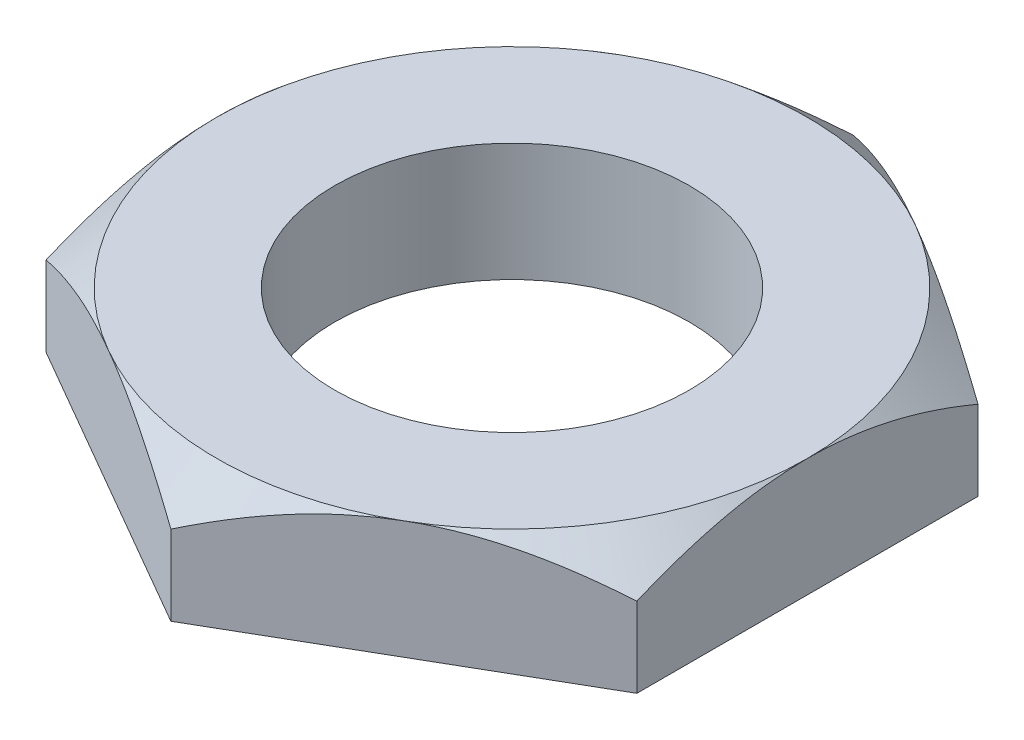
ISO-10303-21;
HEADER;
FILE_DESCRIPTION(('STEP AP214'),'2;1');
FILE_NAME('part.step','',(''),(''),'','','');
FILE_SCHEMA(('AUTOMOTIVE_DESIGN { 1 0 10303 214 1 1 1 1 }'));
ENDSEC;
DATA;
#1=APPLICATION_CONTEXT('core data for automotive mechanical design processes');
#2=APPLICATION_PROTOCOL_DEFINITION('international standard','automotive_design',2000,#1);
#3=PRODUCT_CONTEXT('',#1,'mechanical');
#4=PRODUCT('Part','Part','',(#3));
#5=PRODUCT_RELATED_PRODUCT_CATEGORY('part','',(#4));
#6=PRODUCT_DEFINITION_FORMATION('','',#4);
#7=PRODUCT_DEFINITION_CONTEXT('part definition',#1,'design');
#8=PRODUCT_DEFINITION('design','',#6,#7);
#9=PRODUCT_DEFINITION_SHAPE('','',#8);
#10=(LENGTH_UNIT() NAMED_UNIT(*) SI_UNIT(.MILLI.,.METRE.));
#11=(NAMED_UNIT(*) PLANE_ANGLE_UNIT() SI_UNIT($,.RADIAN.));
#12=(NAMED_UNIT(*) SI_UNIT($,.STERADIAN.) SOLID_ANGLE_UNIT());
#13=UNCERTAINTY_MEASURE_WITH_UNIT(LENGTH_MEASURE(1.E-05),#10,'distance_accuracy_value','');
#14=(GEOMETRIC_REPRESENTATION_CONTEXT(3) GLOBAL_UNCERTAINTY_ASSIGNED_CONTEXT((#13)) GLOBAL_UNIT_ASSIGNED_CONTEXT((#10,
#11,#12)) REPRESENTATION_CONTEXT('',''));
#15=CARTESIAN_POINT('',(0.,0.,0.));
#16=DIRECTION('',(0.,0.,1.));
#17=DIRECTION('',(1.,0.,0.));
#18=AXIS2_PLACEMENT_3D('',#15,#16,#17);
#19=CARTESIAN_POINT('',(0.,2.,0.));
#20=DIRECTION('',(0.,1.,0.));
#21=DIRECTION('',(0.,0.,1.));
#22=AXIS2_PLACEMENT_3D('',#19,#20,#21);
#23=PLANE('',#22);
#24=CARTESIAN_POINT('',(0.,2.,0.));
#25=DIRECTION('',(0.,1.,0.));
#26=DIRECTION('',(0.,0.,1.));
#27=AXIS2_PLACEMENT_3D('',#24,#25,#26);
#28=CIRCLE('',#27,3.);
#29=CARTESIAN_POINT('',(0.,2.,3.));
#30=VERTEX_POINT('',#29);
#31=EDGE_CURVE('E185',#30,#30,#28,.T.);
#32=ORIENTED_EDGE('',*,*,#31,.F.);
#33=EDGE_LOOP('',(#32));
#34=FACE_BOUND('',#33,.T.);
#35=CARTESIAN_POINT('',(0.,2.,0.));
#36=DIRECTION('',(0.,1.,0.));
#37=DIRECTION('',(0.,0.,1.));
#38=AXIS2_PLACEMENT_3D('',#35,#36,#37);
#39=CIRCLE('',#38,5.00000000000002);
#40=CARTESIAN_POINT('',(-2.50000000000003,2.,-4.33012701892217));
#41=VERTEX_POINT('',#40);
#42=CARTESIAN_POINT('',(-5.,2.,0.));
#43=VERTEX_POINT('',#42);
#44=EDGE_CURVE('E48',#41,#43,#39,.T.);
#45=ORIENTED_EDGE('',*,*,#44,.T.);
#46=CARTESIAN_POINT('',(-2.49999999999997,2.,4.3301270189222));
#47=VERTEX_POINT('',#46);
#48=EDGE_CURVE('E56',#43,#47,#39,.T.);
#49=ORIENTED_EDGE('',*,*,#48,.T.);
#50=CARTESIAN_POINT('',(2.50000000000003,2.,4.33012701892217));
#51=VERTEX_POINT('',#50);
#52=EDGE_CURVE('E184',#47,#51,#39,.T.);
#53=ORIENTED_EDGE('',*,*,#52,.T.);
#54=CARTESIAN_POINT('',(4.99999999999999,2.,0.));
#55=VERTEX_POINT('',#54);
#56=EDGE_CURVE('E181',#51,#55,#39,.T.);
#57=ORIENTED_EDGE('',*,*,#56,.T.);
#58=CARTESIAN_POINT('',(2.49999999999996,2.,-4.33012701892222));
#59=VERTEX_POINT('',#58);
#60=EDGE_CURVE('E132',#55,#59,#39,.T.);
#61=ORIENTED_EDGE('',*,*,#60,.T.);
#62=EDGE_CURVE('E323',#59,#41,#39,.T.);
#63=ORIENTED_EDGE('',*,*,#62,.T.);
#64=EDGE_LOOP('',(#45,#49,#53,#57,#61,#63));
#65=FACE_BOUND('',#64,.T.);
#66=ADVANCED_FACE('F33',(#34,#65),#23,.T.);
#67=CARTESIAN_POINT('',(0.,0.,0.));
#68=DIRECTION('',(0.,1.,0.));
#69=DIRECTION('',(0.,0.,1.));
#70=AXIS2_PLACEMENT_3D('',#67,#68,#69);
#71=PLANE('',#70);
#72=DIRECTION('',(-0.866025403784443,0.,-0.499999999999992));
#73=VECTOR('',#72,1.);
#74=CARTESIAN_POINT('',(4.99999999999996,0.,-2.88675134594819));
#75=LINE('',#74,#73);
#76=CARTESIAN_POINT('',(4.99999999999996,0.,-2.88675134594819));
#77=VERTEX_POINT('',#76);
#78=CARTESIAN_POINT('',(0.,0.,-5.77350269189626));
#79=VERTEX_POINT('',#78);
#80=EDGE_CURVE('E188',#77,#79,#75,.T.);
#81=ORIENTED_EDGE('',*,*,#80,.F.);
#82=DIRECTION('',(0.,0.,-1.));
#83=VECTOR('',#82,1.);
#84=CARTESIAN_POINT('',(5.00000000000002,0.,2.88675134594808));
#85=LINE('',#84,#83);
#86=CARTESIAN_POINT('',(5.00000000000002,0.,2.88675134594808));
#87=VERTEX_POINT('',#86);
#88=EDGE_CURVE('E114',#87,#77,#85,.T.);
#89=ORIENTED_EDGE('',*,*,#88,.F.);
#90=DIRECTION('',(0.866025403784435,0.,-0.500000000000007));
#91=VECTOR('',#90,1.);
#92=CARTESIAN_POINT('',(0.,0.,5.77350269189626));
#93=LINE('',#92,#91);
#94=CARTESIAN_POINT('',(0.,0.,5.77350269189626));
#95=VERTEX_POINT('',#94);
#96=EDGE_CURVE('E201',#95,#87,#93,.T.);
#97=ORIENTED_EDGE('',*,*,#96,.F.);
#98=DIRECTION('',(0.866025403784441,0.,0.499999999999995));
#99=VECTOR('',#98,1.);
#100=CARTESIAN_POINT('',(-4.99999999999998,0.,2.88675134594815));
#101=LINE('',#100,#99);
#102=CARTESIAN_POINT('',(-4.99999999999998,0.,2.88675134594815));
#103=VERTEX_POINT('',#102);
#104=EDGE_CURVE('E198',#103,#95,#101,.T.);
#105=ORIENTED_EDGE('',*,*,#104,.F.);
#106=DIRECTION('',(0.,0.,1.));
#107=VECTOR('',#106,1.);
#108=CARTESIAN_POINT('',(-5.00000000000002,0.,-2.88675134594809));
#109=LINE('',#108,#107);
#110=CARTESIAN_POINT('',(-5.00000000000002,0.,-2.88675134594809));
#111=VERTEX_POINT('',#110);
#112=EDGE_CURVE('E195',#111,#103,#109,.T.);
#113=ORIENTED_EDGE('',*,*,#112,.F.);
#114=DIRECTION('',(-0.866025403784435,0.,0.500000000000006));
#115=VECTOR('',#114,1.);
#116=CARTESIAN_POINT('',(0.,0.,-5.77350269189626));
#117=LINE('',#116,#115);
#118=EDGE_CURVE('E192',#79,#111,#117,.T.);
#119=ORIENTED_EDGE('',*,*,#118,.F.);
#120=EDGE_LOOP('',(#81,#89,#97,#105,#113,#119));
#121=FACE_BOUND('',#120,.T.);
#122=CARTESIAN_POINT('',(0.,0.,0.));
#123=DIRECTION('',(0.,1.,0.));
#124=DIRECTION('',(0.,0.,1.));
#125=AXIS2_PLACEMENT_3D('',#122,#123,#124);
#126=CIRCLE('',#125,3.);
#127=CARTESIAN_POINT('',(0.,0.,3.));
#128=VERTEX_POINT('',#127);
#129=EDGE_CURVE('E183',#128,#128,#126,.T.);
#130=ORIENTED_EDGE('',*,*,#129,.T.);
#131=EDGE_LOOP('',(#130));
#132=FACE_BOUND('',#131,.T.);
#133=ADVANCED_FACE('F219',(#121,#132),#71,.F.);
#134=CARTESIAN_POINT('',(4.99999999999996,2.,-2.88675134594819));
#135=DIRECTION('',(-0.499999999999992,0.,0.866025403784443));
#136=DIRECTION('',(0.866025403784443,0.,0.499999999999992));
#137=AXIS2_PLACEMENT_3D('',#134,#135,#136);
#138=PLANE('',#137);
#139=CARTESIAN_POINT('',(-0.000200000000039769,1.35085728272898,-5.7736181619501));
#140=CARTESIAN_POINT('',(0.168107069459491,1.43235685274533,-5.67644603009112));
#141=CARTESIAN_POINT('',(0.338463539065806,1.50876154654002,-5.57809067650572));
#142=CARTESIAN_POINT('',(0.683757305834972,1.64844111395761,-5.37873522731205));
#143=CARTESIAN_POINT('',(0.858707663368208,1.71167261815652,-5.27772759129541));
#144=CARTESIAN_POINT('',(1.21095820672311,1.82099299697271,-5.07435564526727));
#145=CARTESIAN_POINT('',(1.38822218724659,1.867233597078,-4.97201223839442));
#146=CARTESIAN_POINT('',(1.74558214344945,1.94015566360291,-4.76569037148311));
#147=CARTESIAN_POINT('',(1.92567438735552,1.96686100016463,-4.66171406598498));
#148=CARTESIAN_POINT('',(2.29043684617878,1.99883547706574,-4.4511183621931));
#149=CARTESIAN_POINT('',(2.47513256551554,2.00372859389253,-4.34448423891586));
#150=CARTESIAN_POINT('',(2.84397360640151,1.99057704193777,-4.13153376467216));
#151=CARTESIAN_POINT('',(3.02811864921614,1.9725222537672,-4.0252175746332));
#152=CARTESIAN_POINT('',(3.39383508743483,1.91512200083136,-3.81407109058058));
#153=CARTESIAN_POINT('',(3.57540647677513,1.87577648591182,-3.70924080006782));
#154=CARTESIAN_POINT('',(3.93486363281124,1.77882888055508,-3.50170811426824));
#155=CARTESIAN_POINT('',(4.11274779568471,1.72121901617866,-3.39900664494867));
#156=CARTESIAN_POINT('',(4.40929901900364,1.61152999082732,-3.22779271633698));
#157=CARTESIAN_POINT('',(4.52907677499975,1.56336201609214,-3.1586389966697));
#158=CARTESIAN_POINT('',(4.70706601416218,1.48672789112356,-3.05587686152642));
#159=CARTESIAN_POINT('',(4.7660081859784,1.46050560442332,-3.0218465827617));
#160=CARTESIAN_POINT('',(4.88344325259363,1.40668408324608,-2.9540454154391));
#161=CARTESIAN_POINT('',(4.94193598371657,1.37908437224168,-2.92027462137963));
#162=CARTESIAN_POINT('',(5.00019999999996,1.35085728272899,-2.88663587589435));
#163=B_SPLINE_CURVE_WITH_KNOTS('',3,(#139,#140,#141,#142,#143,#144,#145,#146,#147,#148,#149,
#150,#151,#152,#153,#154,#155,#156,#157,#158,#159,#160,#161,#162),.UNSPECIFIED.,.F.,.F.,(4,2,2,
2,2,2,2,2,2,2,2,4),(0.,0.632470935189018,1.26699231750195,1.89570130617709,2.52364078611934,
3.16236454473469,3.80137006054021,4.44037708164896,5.07965645223861,5.51887665022634,
5.73767488389884,5.95654934393438),.UNSPECIFIED.);
#164=CARTESIAN_POINT('',(0.,1.35095417651524,-5.77350269189626));
#165=VERTEX_POINT('',#164);
#166=EDGE_CURVE('E124',#165,#59,#163,.T.);
#167=ORIENTED_EDGE('',*,*,#166,.T.);
#168=CARTESIAN_POINT('',(4.99999999999996,1.35095417651524,-2.88675134594819));
#169=VERTEX_POINT('',#168);
#170=EDGE_CURVE('E121',#59,#169,#163,.T.);
#171=ORIENTED_EDGE('',*,*,#170,.T.);
#172=DIRECTION('',(0.,-1.,0.));
#173=VECTOR('',#172,1.);
#174=CARTESIAN_POINT('',(4.99999999999996,2.,-2.88675134594819));
#175=LINE('',#174,#173);
#176=EDGE_CURVE('E107',#169,#77,#175,.T.);
#177=ORIENTED_EDGE('',*,*,#176,.T.);
#178=ORIENTED_EDGE('',*,*,#80,.T.);
#179=DIRECTION('',(0.,-1.,0.));
#180=VECTOR('',#179,1.);
#181=CARTESIAN_POINT('',(0.,2.,-5.77350269189626));
#182=LINE('',#181,#180);
#183=EDGE_CURVE('E11',#165,#79,#182,.T.);
#184=ORIENTED_EDGE('',*,*,#183,.F.);
#185=EDGE_LOOP('',(#167,#171,#177,#178,#184));
#186=FACE_BOUND('',#185,.T.);
#187=ADVANCED_FACE('F35',(#186),#138,.F.);
#188=CARTESIAN_POINT('',(0.,2.,-5.77350269189626));
#189=DIRECTION('',(0.500000000000006,0.,0.866025403784435));
#190=DIRECTION('',(0.866025403784435,0.,-0.500000000000006));
#191=AXIS2_PLACEMENT_3D('',#188,#189,#190);
#192=PLANE('',#191);
#193=CARTESIAN_POINT('',(-5.00020000000002,1.35085728272899,-2.88663587589425));
#194=CARTESIAN_POINT('',(-4.83189293054049,1.43235685274533,-2.98380800775323));
#195=CARTESIAN_POINT('',(-4.66153646093418,1.50876154654003,-3.08216336133863));
#196=CARTESIAN_POINT('',(-4.31624269416501,1.64844111395761,-3.28151881053231));
#197=CARTESIAN_POINT('',(-4.14129233663178,1.71167261815652,-3.38252644654895));
#198=CARTESIAN_POINT('',(-3.78904179327688,1.82099299697271,-3.5858983925771));
#199=CARTESIAN_POINT('',(-3.6117778127534,1.867233597078,-3.68824179944995));
#200=CARTESIAN_POINT('',(-3.25441785655054,1.94015566360291,-3.89456366636127));
#201=CARTESIAN_POINT('',(-3.07432561264447,1.96686100016464,-3.9985399718594));
#202=CARTESIAN_POINT('',(-2.70956315382122,1.99883547706575,-4.20913567565128));
#203=CARTESIAN_POINT('',(-2.52486743448446,2.00372859389254,-4.31576979892853));
#204=CARTESIAN_POINT('',(-2.15602639359849,1.99057704193777,-4.52872027317223));
#205=CARTESIAN_POINT('',(-1.97188135078386,1.9725222537672,-4.63503646321119));
#206=CARTESIAN_POINT('',(-1.60616491256518,1.91512200083137,-4.84618294726383));
#207=CARTESIAN_POINT('',(-1.42459352322488,1.87577648591183,-4.95101323777658));
#208=CARTESIAN_POINT('',(-1.06513636718877,1.77882888055509,-5.15854592357617));
#209=CARTESIAN_POINT('',(-0.887252204315303,1.72121901617867,-5.26124739289574));
#210=CARTESIAN_POINT('',(-0.590700980996371,1.61152999082732,-5.43246132150744));
#211=CARTESIAN_POINT('',(-0.470923225000259,1.56336201609215,-5.50161504117473));
#212=CARTESIAN_POINT('',(-0.292933985837832,1.48672789112357,-5.60437717631802));
#213=CARTESIAN_POINT('',(-0.233991814021608,1.46050560442332,-5.63840745508273));
#214=CARTESIAN_POINT('',(-0.116556747406373,1.40668408324608,-5.70620862240534));
#215=CARTESIAN_POINT('',(-0.0580640162834327,1.37908437224168,-5.73997941646481));
#216=CARTESIAN_POINT('',(0.000199999999960354,1.35085728272898,-5.7736181619501));
#217=B_SPLINE_CURVE_WITH_KNOTS('',3,(#193,#194,#195,#196,#197,#198,#199,#200,#201,#202,#203,
#204,#205,#206,#207,#208,#209,#210,#211,#212,#213,#214,#215,#216),.UNSPECIFIED.,.F.,.F.,(4,2,2,
2,2,2,2,2,2,2,2,4),(0.,0.63247093518902,1.26699231750195,1.89570130617709,2.52364078611934,
3.16236454473469,3.80137006054021,4.44037708164897,5.07965645223861,5.51887665022635,
5.73767488389887,5.9565493439344),.UNSPECIFIED.);
#218=CARTESIAN_POINT('',(-5.00000000000002,1.35095417651524,-2.88675134594809));
#219=VERTEX_POINT('',#218);
#220=EDGE_CURVE('E129',#219,#41,#217,.T.);
#221=ORIENTED_EDGE('',*,*,#220,.T.);
#222=EDGE_CURVE('E171',#41,#165,#217,.T.);
#223=ORIENTED_EDGE('',*,*,#222,.T.);
#224=ORIENTED_EDGE('',*,*,#183,.T.);
#225=ORIENTED_EDGE('',*,*,#118,.T.);
#226=DIRECTION('',(0.,-1.,0.));
#227=VECTOR('',#226,1.);
#228=CARTESIAN_POINT('',(-5.00000000000002,2.,-2.88675134594809));
#229=LINE('',#228,#227);
#230=EDGE_CURVE('E41',#219,#111,#229,.T.);
#231=ORIENTED_EDGE('',*,*,#230,.F.);
#232=EDGE_LOOP('',(#221,#223,#224,#225,#231));
#233=FACE_BOUND('',#232,.T.);
#234=ADVANCED_FACE('F217',(#233),#192,.F.);
#235=CARTESIAN_POINT('',(-5.00000000000002,2.,-2.88675134594809));
#236=DIRECTION('',(1.,0.,0.));
#237=DIRECTION('',(0.,0.,-1.));
#238=AXIS2_PLACEMENT_3D('',#235,#236,#237);
#239=PLANE('',#238);
#240=CARTESIAN_POINT('',(-5.00000000000004,-1.00493618566232,-6.97395323170403));
#241=CARTESIAN_POINT('',(-5.00000000000004,-0.884920561980129,-6.79792154926906));
#242=CARTESIAN_POINT('',(-5.00000000000004,-0.765916754460766,-6.62118932313648));
#243=CARTESIAN_POINT('',(-5.00000000000004,-0.53043685678145,-6.26600052236355));
#244=CARTESIAN_POINT('',(-5.00000000000004,-0.413961268241943,-6.0875436155013));
#245=CARTESIAN_POINT('',(-5.00000000000004,-0.183296059942118,-5.72741240657323));
#246=CARTESIAN_POINT('',(-5.00000000000003,-0.0691277719026803,-5.54572439827031));
#247=CARTESIAN_POINT('',(-5.00000000000003,0.155340935932159,-5.17998306688135));
#248=CARTESIAN_POINT('',(-5.00000000000003,0.265641588148065,-4.99592988683865));
#249=CARTESIAN_POINT('',(-5.00000000000003,0.488232787096724,-4.61331754511238));
#250=CARTESIAN_POINT('',(-5.00000000000003,0.600210387652964,-4.4145753976577));
#251=CARTESIAN_POINT('',(-5.00000000000003,0.817218357991397,-4.01326856743685));
#252=CARTESIAN_POINT('',(-5.00000000000002,0.922247617229847,-3.81070328024139));
#253=CARTESIAN_POINT('',(-5.00000000000002,1.12301998221158,-3.40164960829692));
#254=CARTESIAN_POINT('',(-5.00000000000002,1.21878694287351,-3.1951730332167));
#255=CARTESIAN_POINT('',(-5.00000000000002,1.39860711155078,-2.7772227787068));
#256=CARTESIAN_POINT('',(-5.00000000000002,1.48266541093537,-2.56575131832354));
#257=CARTESIAN_POINT('',(-5.00000000000001,1.63204213934308,-2.14744586686461));
#258=CARTESIAN_POINT('',(-5.00000000000001,1.6980581368938,-1.94086455901713));
#259=CARTESIAN_POINT('',(-5.00000000000001,1.81283876227308,-1.52288612303315));
#260=CARTESIAN_POINT('',(-5.00000000000001,1.8616050235038,-1.311489452889));
#261=CARTESIAN_POINT('',(-5.00000000000001,1.93759123818846,-0.889297133854288));
#262=CARTESIAN_POINT('',(-5.00000000000001,1.96523679572522,-0.678579830428133));
#263=CARTESIAN_POINT('',(-5.,1.99824545183374,-0.255388737822962));
#264=CARTESIAN_POINT('',(-5.,2.00361246836666,-0.0429152640746513));
#265=CARTESIAN_POINT('',(-5.,1.99211633287782,0.362555629072887));
#266=CARTESIAN_POINT('',(-5.,1.97717982074591,0.555611420506366));
#267=CARTESIAN_POINT('',(-5.,1.92955556303353,0.93948817802343));
#268=CARTESIAN_POINT('',(-4.99999999999999,1.89686652055383,1.13030897979077));
#269=CARTESIAN_POINT('',(-4.99999999999999,1.81497627616115,1.51283286967901));
#270=CARTESIAN_POINT('',(-4.99999999999999,1.76541913470602,1.7044587111594));
#271=CARTESIAN_POINT('',(-4.99999999999999,1.6809108267205,1.98877639781813));
#272=CARTESIAN_POINT('',(-4.99999999999999,1.65104649941087,2.08302734516313));
#273=CARTESIAN_POINT('',(-4.99999999999999,1.58825338362999,2.2705006320498));
#274=CARTESIAN_POINT('',(-4.99999999999999,1.55532471698446,2.36372301231847));
#275=CARTESIAN_POINT('',(-4.99999999999999,1.45586013493247,2.63255441630481));
#276=CARTESIAN_POINT('',(-4.99999999999998,1.38573823175124,2.80684017965425));
#277=CARTESIAN_POINT('',(-4.99999999999998,1.23748600296383,3.15199359731943));
#278=CARTESIAN_POINT('',(-4.99999999999998,1.15935316966445,3.32286016118175));
#279=CARTESIAN_POINT('',(-4.99999999999998,0.996555323793989,3.66169069368958));
#280=CARTESIAN_POINT('',(-4.99999999999998,0.911882526176446,3.82965090237957));
#281=CARTESIAN_POINT('',(-4.99999999999998,0.737343431506078,4.16281515559553));
#282=CARTESIAN_POINT('',(-4.99999999999998,0.647477642543163,4.32801946773111));
#283=CARTESIAN_POINT('',(-4.99999999999997,0.462948387113405,4.65707925897962));
#284=CARTESIAN_POINT('',(-4.99999999999997,0.368258403320861,4.82091981532934));
#285=CARTESIAN_POINT('',(-4.99999999999997,0.175374721722355,5.14652959311659));
#286=CARTESIAN_POINT('',(-4.99999999999997,0.0771808382101983,5.30829870414854));
#287=CARTESIAN_POINT('',(-4.99999999999997,-0.221567624279057,5.79072473768294));
#288=CARTESIAN_POINT('',(-4.99999999999996,-0.426415766091283,6.10872233210939));
#289=CARTESIAN_POINT('',(-4.99999999999996,-0.821323590702173,6.70507510962866));
#290=CARTESIAN_POINT('',(-4.99999999999996,-1.01056547253838,6.98397721634399));
#291=CARTESIAN_POINT('',(-4.99999999999996,-1.39382598506127,7.53854058255224));
#292=CARTESIAN_POINT('',(-4.99999999999995,-1.58784536492691,7.81420132360969));
#293=CARTESIAN_POINT('',(-4.99999999999995,-1.97686503044069,8.35924993725873));
#294=CARTESIAN_POINT('',(-4.99999999999995,-2.17181711665618,8.62867232917529));
#295=CARTESIAN_POINT('',(-4.99999999999995,-2.56446444102405,9.16540324705457));
#296=CARTESIAN_POINT('',(-4.99999999999994,-2.76215894018497,9.43271231313976));
#297=CARTESIAN_POINT('',(-4.99999999999994,-2.9608903382153,9.69923767564126));
#298=B_SPLINE_CURVE_WITH_KNOTS('',3,(#240,#241,#242,#243,#244,#245,#246,#247,#248,#249,#250,
#251,#252,#253,#254,#255,#256,#257,#258,#259,#260,#261,#262,#263,#264,#265,#266,#267,#268,#269,
#270,#271,#272,#273,#274,#275,#276,#277,#278,#279,#280,#281,#282,#283,#284,#285,#286,#287,#288,
#289,#290,#291,#292,#293,#294,#295,#296,#297),.UNSPECIFIED.,.F.,.F.,(4,2,2,2,2,2,2,2,2,2,2,2,2,
2,2,2,2,2,2,2,2,2,2,2,2,2,2,2,4),(0.,0.639163840317743,1.27845335800499,1.92215612968767,
2.56582015236959,3.25006344189742,3.93441583018069,4.61695592483443,5.29919829244955,
5.94921892026893,6.59917798021869,7.23566653169497,7.87204314392439,8.45206137626613,
9.03212198715343,9.62527117372569,9.9218365805923,10.218390202252,10.7817069963716,
11.3452006692982,11.9093757701518,12.4734957644402,13.0411479930748,13.6088303520143,
14.7434287393096,15.7545101872014,16.7657512095253,17.7634061081864,18.7607972011236),.UNSPECIFIED.);
#299=CARTESIAN_POINT('',(-4.99999999999998,1.35095417651524,2.88675134594815));
#300=VERTEX_POINT('',#299);
#301=EDGE_CURVE('E170',#300,#43,#298,.F.);
#302=ORIENTED_EDGE('',*,*,#301,.T.);
#303=EDGE_CURVE('E165',#43,#219,#298,.F.);
#304=ORIENTED_EDGE('',*,*,#303,.T.);
#305=ORIENTED_EDGE('',*,*,#230,.T.);
#306=ORIENTED_EDGE('',*,*,#112,.T.);
#307=DIRECTION('',(0.,-1.,0.));
#308=VECTOR('',#307,1.);
#309=CARTESIAN_POINT('',(-4.99999999999998,2.,2.88675134594815));
#310=LINE('',#309,#308);
#311=EDGE_CURVE('E208',#300,#103,#310,.T.);
#312=ORIENTED_EDGE('',*,*,#311,.F.);
#313=EDGE_LOOP('',(#302,#304,#305,#306,#312));
#314=FACE_BOUND('',#313,.T.);
#315=ADVANCED_FACE('F211',(#314),#239,.F.);
#316=CARTESIAN_POINT('',(-4.99999999999998,2.,2.88675134594815));
#317=DIRECTION('',(0.499999999999995,0.,-0.866025403784442));
#318=DIRECTION('',(-0.866025403784442,0.,-0.499999999999995));
#319=AXIS2_PLACEMENT_3D('',#316,#317,#318);
#320=PLANE('',#319);
#321=CARTESIAN_POINT('',(0.000200000000040189,1.35085728272899,5.77361816195009));
#322=CARTESIAN_POINT('',(-0.16810706945949,1.43235685274533,5.67644603009112));
#323=CARTESIAN_POINT('',(-0.338463539065806,1.50876154654003,5.57809067650572));
#324=CARTESIAN_POINT('',(-0.683757305834971,1.64844111395761,5.37873522731204));
#325=CARTESIAN_POINT('',(-0.858707663368207,1.71167261815652,5.27772759129541));
#326=CARTESIAN_POINT('',(-1.21095820672311,1.82099299697271,5.07435564526727));
#327=CARTESIAN_POINT('',(-1.38822218724659,1.867233597078,4.97201223839441));
#328=CARTESIAN_POINT('',(-1.74558214344945,1.94015566360292,4.7656903714831));
#329=CARTESIAN_POINT('',(-1.92567438735552,1.96686100016464,4.66171406598497));
#330=CARTESIAN_POINT('',(-2.29043684617878,1.99883547706575,4.45111836219309));
#331=CARTESIAN_POINT('',(-2.47513256551554,2.00372859389254,4.34448423891585));
#332=CARTESIAN_POINT('',(-2.84397360640151,1.99057704193778,4.13153376467215));
#333=CARTESIAN_POINT('',(-3.02811864921614,1.97252225376721,4.02521757463319));
#334=CARTESIAN_POINT('',(-3.39383508743483,1.91512200083137,3.81407109058056));
#335=CARTESIAN_POINT('',(-3.57540647677513,1.87577648591183,3.70924080006781));
#336=CARTESIAN_POINT('',(-3.93486363281124,1.77882888055509,3.50170811426822));
#337=CARTESIAN_POINT('',(-4.11274779568471,1.72121901617867,3.39900664494865));
#338=CARTESIAN_POINT('',(-4.40929901900365,1.61152999082733,3.22779271633696));
#339=CARTESIAN_POINT('',(-4.52907677499976,1.56336201609215,3.15863899666967));
#340=CARTESIAN_POINT('',(-4.70706601416219,1.48672789112357,3.05587686152639));
#341=CARTESIAN_POINT('',(-4.76600818597841,1.46050560442332,3.02184658276167));
#342=CARTESIAN_POINT('',(-4.88344325259365,1.40668408324608,2.95404541543906));
#343=CARTESIAN_POINT('',(-4.94193598371659,1.37908437224168,2.9202746213796));
#344=CARTESIAN_POINT('',(-5.00019999999998,1.35085728272899,2.88663587589431));
#345=B_SPLINE_CURVE_WITH_KNOTS('',3,(#321,#322,#323,#324,#325,#326,#327,#328,#329,#330,#331,
#332,#333,#334,#335,#336,#337,#338,#339,#340,#341,#342,#343,#344),.UNSPECIFIED.,.F.,.F.,(4,2,2,
2,2,2,2,2,2,2,2,4),(0.,0.632470935189021,1.26699231750196,1.89570130617709,2.52364078611935,
3.1623645447347,3.80137006054022,4.44037708164897,5.07965645223862,5.51887665022636,
5.73767488389888,5.95654934393441),.UNSPECIFIED.);
#346=EDGE_CURVE('E159',#47,#300,#345,.T.);
#347=ORIENTED_EDGE('',*,*,#346,.T.);
#348=ORIENTED_EDGE('',*,*,#311,.T.);
#349=ORIENTED_EDGE('',*,*,#104,.T.);
#350=DIRECTION('',(0.,-1.,0.));
#351=VECTOR('',#350,1.);
#352=CARTESIAN_POINT('',(0.,2.,5.77350269189626));
#353=LINE('',#352,#351);
#354=CARTESIAN_POINT('',(0.,1.35095417651524,5.77350269189626));
#355=VERTEX_POINT('',#354);
#356=EDGE_CURVE('E206',#355,#95,#353,.T.);
#357=ORIENTED_EDGE('',*,*,#356,.F.);
#358=EDGE_CURVE('E164',#355,#47,#345,.T.);
#359=ORIENTED_EDGE('',*,*,#358,.T.);
#360=EDGE_LOOP('',(#347,#348,#349,#357,#359));
#361=FACE_BOUND('',#360,.T.);
#362=ADVANCED_FACE('F224',(#361),#320,.F.);
#363=CARTESIAN_POINT('',(0.,2.,5.77350269189626));
#364=DIRECTION('',(-0.500000000000007,0.,-0.866025403784435));
#365=DIRECTION('',(-0.866025403784435,0.,0.500000000000007));
#366=AXIS2_PLACEMENT_3D('',#363,#364,#365);
#367=PLANE('',#366);
#368=CARTESIAN_POINT('',(5.00020000000002,1.35085728272898,2.88663587589424));
#369=CARTESIAN_POINT('',(4.8318929305405,1.43235685274533,2.98380800775322));
#370=CARTESIAN_POINT('',(4.66153646093418,1.50876154654003,3.08216336133862));
#371=CARTESIAN_POINT('',(4.31624269416502,1.64844111395761,3.2815188105323));
#372=CARTESIAN_POINT('',(4.14129233663178,1.71167261815652,3.38252644654894));
#373=CARTESIAN_POINT('',(3.78904179327688,1.82099299697271,3.58589839257709));
#374=CARTESIAN_POINT('',(3.61177781275341,1.867233597078,3.68824179944994));
#375=CARTESIAN_POINT('',(3.25441785655055,1.94015566360292,3.89456366636126));
#376=CARTESIAN_POINT('',(3.07432561264448,1.96686100016464,3.9985399718594));
#377=CARTESIAN_POINT('',(2.70956315382122,1.99883547706575,4.20913567565127));
#378=CARTESIAN_POINT('',(2.52486743448447,2.00372859389254,4.31576979892852));
#379=CARTESIAN_POINT('',(2.1560263935985,1.99057704193778,4.52872027317223));
#380=CARTESIAN_POINT('',(1.97188135078387,1.9725222537672,4.63503646321119));
#381=CARTESIAN_POINT('',(1.60616491256519,1.91512200083137,4.84618294726382));
#382=CARTESIAN_POINT('',(1.42459352322489,1.87577648591183,4.95101323777658));
#383=CARTESIAN_POINT('',(1.06513636718877,1.77882888055509,5.15854592357617));
#384=CARTESIAN_POINT('',(0.887252204315307,1.72121901617867,5.26124739289574));
#385=CARTESIAN_POINT('',(0.590700980996374,1.61152999082733,5.43246132150744));
#386=CARTESIAN_POINT('',(0.470923225000262,1.56336201609215,5.50161504117473));
#387=CARTESIAN_POINT('',(0.292933985837834,1.48672789112357,5.60437717631801));
#388=CARTESIAN_POINT('',(0.23399181402161,1.46050560442332,5.63840745508273));
#389=CARTESIAN_POINT('',(0.116556747406374,1.40668408324608,5.70620862240534));
#390=CARTESIAN_POINT('',(0.0580640162834333,1.37908437224168,5.73997941646481));
#391=CARTESIAN_POINT('',(-0.000199999999960147,1.35085728272899,5.77361816195009));
#392=B_SPLINE_CURVE_WITH_KNOTS('',3,(#368,#369,#370,#371,#372,#373,#374,#375,#376,#377,#378,
#379,#380,#381,#382,#383,#384,#385,#386,#387,#388,#389,#390,#391),.UNSPECIFIED.,.F.,.F.,(4,2,2,
2,2,2,2,2,2,2,2,4),(0.,0.63247093518902,1.26699231750195,1.89570130617709,2.52364078611935,
3.1623645447347,3.80137006054022,4.44037708164897,5.07965645223862,5.51887665022636,
5.73767488389887,5.95654934393441),.UNSPECIFIED.);
#393=EDGE_CURVE('E133',#51,#355,#392,.T.);
#394=ORIENTED_EDGE('',*,*,#393,.T.);
#395=ORIENTED_EDGE('',*,*,#356,.T.);
#396=ORIENTED_EDGE('',*,*,#96,.T.);
#397=DIRECTION('',(0.,-1.,0.));
#398=VECTOR('',#397,1.);
#399=CARTESIAN_POINT('',(5.00000000000002,2.,2.88675134594808));
#400=LINE('',#399,#398);
#401=CARTESIAN_POINT('',(5.00000000000002,1.35095417651524,2.88675134594808));
#402=VERTEX_POINT('',#401);
#403=EDGE_CURVE('E118',#402,#87,#400,.T.);
#404=ORIENTED_EDGE('',*,*,#403,.F.);
#405=EDGE_CURVE('E136',#402,#51,#392,.T.);
#406=ORIENTED_EDGE('',*,*,#405,.T.);
#407=EDGE_LOOP('',(#394,#395,#396,#404,#406));
#408=FACE_BOUND('',#407,.T.);
#409=ADVANCED_FACE('F252',(#408),#367,.F.);
#410=CARTESIAN_POINT('',(5.00000000000002,2.,2.88675134594808));
#411=DIRECTION('',(-1.,0.,0.));
#412=DIRECTION('',(0.,0.,1.));
#413=AXIS2_PLACEMENT_3D('',#410,#411,#412);
#414=PLANE('',#413);
#415=CARTESIAN_POINT('',(4.99999999999992,-1.00493618566233,-6.97395323170413));
#416=CARTESIAN_POINT('',(4.99999999999992,-0.884920561980143,-6.79792154926916));
#417=CARTESIAN_POINT('',(4.99999999999993,-0.76591675446078,-6.62118932313658));
#418=CARTESIAN_POINT('',(4.99999999999993,-0.530436856781463,-6.26600052236366));
#419=CARTESIAN_POINT('',(4.99999999999993,-0.413961268241955,-6.0875436155014));
#420=CARTESIAN_POINT('',(4.99999999999994,-0.183296059942128,-5.72741240657333));
#421=CARTESIAN_POINT('',(4.99999999999994,-0.0691277719026891,-5.54572439827041));
#422=CARTESIAN_POINT('',(4.99999999999994,0.155340935932151,-5.17998306688146));
#423=CARTESIAN_POINT('',(4.99999999999994,0.265641588148058,-4.99592988683875));
#424=CARTESIAN_POINT('',(4.99999999999995,0.488232787096718,-4.61331754511248));
#425=CARTESIAN_POINT('',(4.99999999999995,0.600210387652959,-4.4145753976578));
#426=CARTESIAN_POINT('',(4.99999999999995,0.817218357991394,-4.01326856743695));
#427=CARTESIAN_POINT('',(4.99999999999995,0.922247617229846,-3.81070328024148));
#428=CARTESIAN_POINT('',(4.99999999999996,1.12301998221158,-3.40164960829701));
#429=CARTESIAN_POINT('',(4.99999999999996,1.21878694287351,-3.1951730332168));
#430=CARTESIAN_POINT('',(4.99999999999997,1.39860711155078,-2.77722277870689));
#431=CARTESIAN_POINT('',(4.99999999999997,1.48266541093537,-2.56575131832363));
#432=CARTESIAN_POINT('',(4.99999999999997,1.63204213934308,-2.1474458668647));
#433=CARTESIAN_POINT('',(4.99999999999997,1.6980581368938,-1.94086455901722));
#434=CARTESIAN_POINT('',(4.99999999999998,1.81283876227308,-1.52288612303324));
#435=CARTESIAN_POINT('',(4.99999999999998,1.86160502350381,-1.31148945288909));
#436=CARTESIAN_POINT('',(4.99999999999998,1.93759123818847,-0.889297133854377));
#437=CARTESIAN_POINT('',(4.99999999999999,1.96523679572523,-0.678579830428222));
#438=CARTESIAN_POINT('',(4.99999999999999,1.99824545183375,-0.255388737823051));
#439=CARTESIAN_POINT('',(4.99999999999999,2.00361246836667,-0.0429152640747392));
#440=CARTESIAN_POINT('',(5.,1.99211633287783,0.3625556290728));
#441=CARTESIAN_POINT('',(5.,1.97717982074591,0.555611420506279));
#442=CARTESIAN_POINT('',(5.,1.92955556303354,0.939488178023343));
#443=CARTESIAN_POINT('',(5.00000000000001,1.89686652055383,1.13030897979068));
#444=CARTESIAN_POINT('',(5.00000000000001,1.81497627616116,1.51283286967892));
#445=CARTESIAN_POINT('',(5.00000000000001,1.76541913470602,1.70445871115931));
#446=CARTESIAN_POINT('',(5.00000000000002,1.68091082672051,1.98877639781804));
#447=CARTESIAN_POINT('',(5.00000000000002,1.65104649941088,2.08302734516304));
#448=CARTESIAN_POINT('',(5.00000000000002,1.58825338363,2.27050063204971));
#449=CARTESIAN_POINT('',(5.00000000000002,1.55532471698447,2.36372301231838));
#450=CARTESIAN_POINT('',(5.00000000000002,1.45586013493248,2.63255441630472));
#451=CARTESIAN_POINT('',(5.00000000000002,1.38573823175124,2.80684017965416));
#452=CARTESIAN_POINT('',(5.00000000000003,1.23748600296383,3.15199359731934));
#453=CARTESIAN_POINT('',(5.00000000000003,1.15935316966445,3.32286016118166));
#454=CARTESIAN_POINT('',(5.00000000000003,0.996555323793997,3.66169069368949));
#455=CARTESIAN_POINT('',(5.00000000000003,0.911882526176455,3.82965090237949));
#456=CARTESIAN_POINT('',(5.00000000000004,0.737343431506087,4.16281515559545));
#457=CARTESIAN_POINT('',(5.00000000000004,0.647477642543172,4.32801946773102));
#458=CARTESIAN_POINT('',(5.00000000000004,0.462948387113414,4.65707925897953));
#459=CARTESIAN_POINT('',(5.00000000000004,0.368258403320871,4.82091981532925));
#460=CARTESIAN_POINT('',(5.00000000000005,0.175374721722366,5.1465295931165));
#461=CARTESIAN_POINT('',(5.00000000000005,0.0771808382102084,5.30829870414845));
#462=CARTESIAN_POINT('',(5.00000000000006,-0.221567624279047,5.79072473768284));
#463=CARTESIAN_POINT('',(5.00000000000006,-0.426415766091272,6.1087223321093));
#464=CARTESIAN_POINT('',(5.00000000000006,-0.821323590702159,6.70507510962856));
#465=CARTESIAN_POINT('',(5.00000000000007,-1.01056547253837,6.98397721634389));
#466=CARTESIAN_POINT('',(5.00000000000007,-1.39382598506125,7.53854058255214));
#467=CARTESIAN_POINT('',(5.00000000000008,-1.58784536492689,7.81420132360959));
#468=CARTESIAN_POINT('',(5.00000000000008,-1.97686503044068,8.35924993725864));
#469=CARTESIAN_POINT('',(5.00000000000008,-2.17181711665616,8.62867232917519));
#470=CARTESIAN_POINT('',(5.00000000000009,-2.56446444102403,9.16540324705447));
#471=CARTESIAN_POINT('',(5.00000000000009,-2.76215894018495,9.43271231313965));
#472=CARTESIAN_POINT('',(5.0000000000001,-2.96089033821527,9.69923767564115));
#473=B_SPLINE_CURVE_WITH_KNOTS('',3,(#415,#416,#417,#418,#419,#420,#421,#422,#423,#424,#425,
#426,#427,#428,#429,#430,#431,#432,#433,#434,#435,#436,#437,#438,#439,#440,#441,#442,#443,#444,
#445,#446,#447,#448,#449,#450,#451,#452,#453,#454,#455,#456,#457,#458,#459,#460,#461,#462,#463,
#464,#465,#466,#467,#468,#469,#470,#471,#472),.UNSPECIFIED.,.F.,.F.,(4,2,2,2,2,2,2,2,2,2,2,2,2,
2,2,2,2,2,2,2,2,2,2,2,2,2,2,2,4),(0.,0.639163840317746,1.27845335800499,1.92215612968768,
2.5658201523696,3.25006344189743,3.9344158301807,4.61695592483445,5.29919829244957,
5.94921892026896,6.59917798021871,7.23566653169499,7.87204314392441,8.45206137626616,
9.03212198715345,9.62527117372572,9.92183658059232,10.218390202252,10.7817069963716,
11.3452006692982,11.9093757701519,12.4734957644402,13.0411479930748,13.6088303520143,
14.7434287393097,15.7545101872014,16.7657512095253,17.7634061081864,18.7607972011236),.UNSPECIFIED.);
#474=EDGE_CURVE('E111',#169,#55,#473,.T.);
#475=ORIENTED_EDGE('',*,*,#474,.T.);
#476=EDGE_CURVE('E134',#55,#402,#473,.T.);
#477=ORIENTED_EDGE('',*,*,#476,.T.);
#478=ORIENTED_EDGE('',*,*,#403,.T.);
#479=ORIENTED_EDGE('',*,*,#88,.T.);
#480=ORIENTED_EDGE('',*,*,#176,.F.);
#481=EDGE_LOOP('',(#475,#477,#478,#479,#480));
#482=FACE_BOUND('',#481,.T.);
#483=ADVANCED_FACE('F109',(#482),#414,.F.);
#484=CARTESIAN_POINT('',(0.,2.,0.));
#485=DIRECTION('',(0.,-1.,0.));
#486=DIRECTION('',(0.,0.,-1.));
#487=AXIS2_PLACEMENT_3D('',#484,#485,#486);
#488=CYLINDRICAL_SURFACE('',#487,3.);
#489=ORIENTED_EDGE('',*,*,#31,.T.);
#490=EDGE_LOOP('',(#489));
#491=FACE_BOUND('',#490,.T.);
#492=ORIENTED_EDGE('',*,*,#129,.F.);
#493=EDGE_LOOP('',(#492));
#494=FACE_BOUND('',#493,.T.);
#495=ADVANCED_FACE('F238',(#491,#494),#488,.F.);
#496=CARTESIAN_POINT('',(0.,2.,0.));
#497=DIRECTION('',(0.,-1.,0.));
#498=DIRECTION('',(0.,0.,1.));
#499=AXIS2_PLACEMENT_3D('',#496,#497,#498);
#500=CONICAL_SURFACE('',#499,5.00000000000002,0.872664625997166);
#501=ORIENTED_EDGE('',*,*,#405,.F.);
#502=ORIENTED_EDGE('',*,*,#476,.F.);
#503=ORIENTED_EDGE('',*,*,#56,.F.);
#504=EDGE_LOOP('',(#501,#502,#503));
#505=FACE_BOUND('',#504,.T.);
#506=ADVANCED_FACE('F230',(#505),#500,.T.);
#507=ORIENTED_EDGE('',*,*,#170,.F.);
#508=ORIENTED_EDGE('',*,*,#60,.F.);
#509=ORIENTED_EDGE('',*,*,#474,.F.);
#510=EDGE_LOOP('',(#507,#508,#509));
#511=FACE_BOUND('',#510,.T.);
#512=ADVANCED_FACE('F131',(#511),#500,.T.);
#513=ORIENTED_EDGE('',*,*,#358,.F.);
#514=ORIENTED_EDGE('',*,*,#393,.F.);
#515=ORIENTED_EDGE('',*,*,#52,.F.);
#516=EDGE_LOOP('',(#513,#514,#515));
#517=FACE_BOUND('',#516,.T.);
#518=ADVANCED_FACE('F229',(#517),#500,.T.);
#519=ORIENTED_EDGE('',*,*,#301,.F.);
#520=ORIENTED_EDGE('',*,*,#346,.F.);
#521=ORIENTED_EDGE('',*,*,#48,.F.);
#522=EDGE_LOOP('',(#519,#520,#521));
#523=FACE_BOUND('',#522,.T.);
#524=ADVANCED_FACE('F148',(#523),#500,.T.);
#525=ORIENTED_EDGE('',*,*,#303,.F.);
#526=ORIENTED_EDGE('',*,*,#44,.F.);
#527=ORIENTED_EDGE('',*,*,#220,.F.);
#528=EDGE_LOOP('',(#525,#526,#527));
#529=FACE_BOUND('',#528,.T.);
#530=ADVANCED_FACE('F228',(#529),#500,.T.);
#531=ORIENTED_EDGE('',*,*,#222,.F.);
#532=ORIENTED_EDGE('',*,*,#62,.F.);
#533=ORIENTED_EDGE('',*,*,#166,.F.);
#534=EDGE_LOOP('',(#531,#532,#533));
#535=FACE_BOUND('',#534,.T.);
#536=ADVANCED_FACE('F235',(#535),#500,.T.);
#537=CLOSED_SHELL('',(#66,#133,#187,#234,#315,#362,#409,#483,#495,#506,#512,#518,#524,#530,#536));
#538=MANIFOLD_SOLID_BREP('B2',#537);
#539=ADVANCED_BREP_SHAPE_REPRESENTATION('',(#18,#538),#14);
#540=SHAPE_DEFINITION_REPRESENTATION(#9,#539);
ENDSEC;
END-ISO-10303-21;
